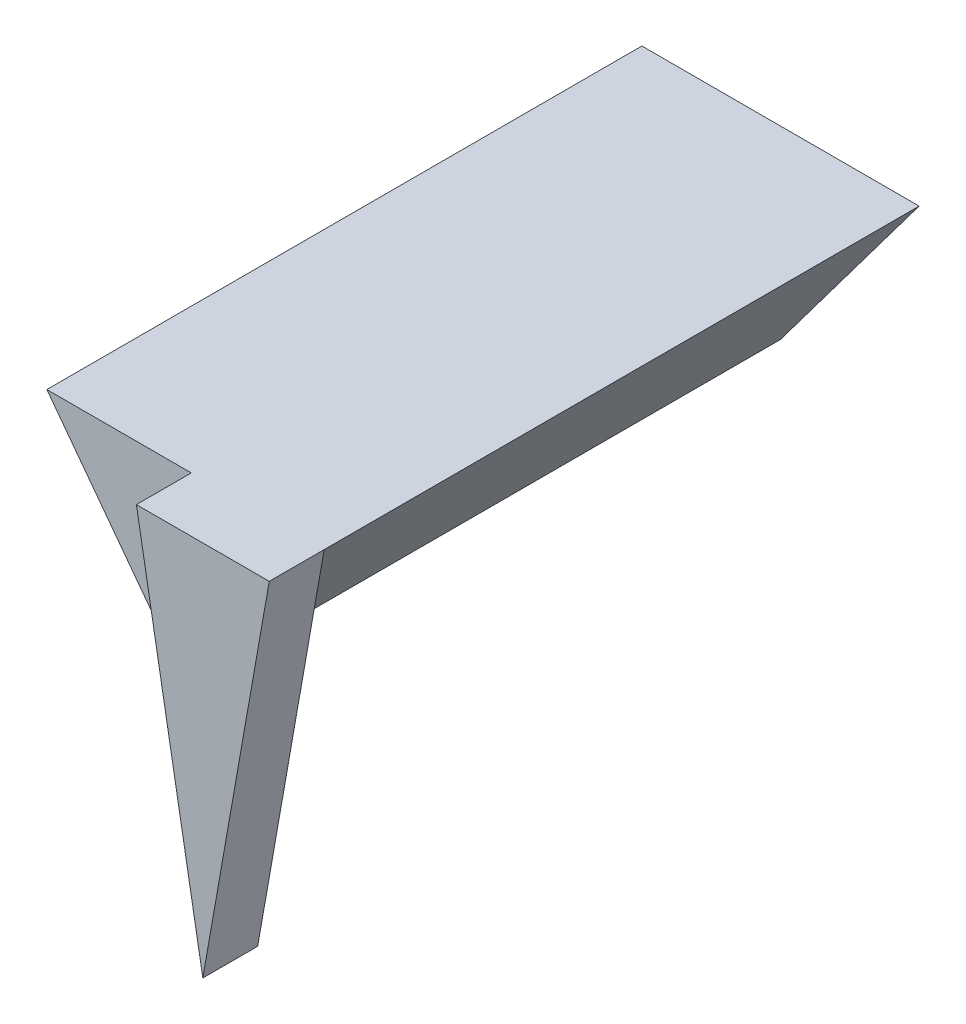
ISO-10303-21;
HEADER;
FILE_DESCRIPTION(('STEP AP214'),'2;1');
FILE_NAME('part.step','',(''),(''),'','','');
FILE_SCHEMA(('AUTOMOTIVE_DESIGN { 1 0 10303 214 1 1 1 1 }'));
ENDSEC;
DATA;
#1=APPLICATION_CONTEXT('core data for automotive mechanical design processes');
#2=APPLICATION_PROTOCOL_DEFINITION('international standard','automotive_design',2000,#1);
#3=PRODUCT_CONTEXT('',#1,'mechanical');
#4=PRODUCT('Part','Part','',(#3));
#5=PRODUCT_RELATED_PRODUCT_CATEGORY('part','',(#4));
#6=PRODUCT_DEFINITION_FORMATION('','',#4);
#7=PRODUCT_DEFINITION_CONTEXT('part definition',#1,'design');
#8=PRODUCT_DEFINITION('design','',#6,#7);
#9=PRODUCT_DEFINITION_SHAPE('','',#8);
#10=(LENGTH_UNIT() NAMED_UNIT(*) SI_UNIT(.MILLI.,.METRE.));
#11=(NAMED_UNIT(*) PLANE_ANGLE_UNIT() SI_UNIT($,.RADIAN.));
#12=(NAMED_UNIT(*) SI_UNIT($,.STERADIAN.) SOLID_ANGLE_UNIT());
#13=UNCERTAINTY_MEASURE_WITH_UNIT(LENGTH_MEASURE(1.E-05),#10,'distance_accuracy_value','');
#14=(GEOMETRIC_REPRESENTATION_CONTEXT(3) GLOBAL_UNCERTAINTY_ASSIGNED_CONTEXT((#13)) GLOBAL_UNIT_ASSIGNED_CONTEXT((#10,
#11,#12)) REPRESENTATION_CONTEXT('',''));
#15=CARTESIAN_POINT('',(0.,0.,0.));
#16=DIRECTION('',(0.,0.,1.));
#17=DIRECTION('',(1.,0.,0.));
#18=AXIS2_PLACEMENT_3D('',#15,#16,#17);
#19=CARTESIAN_POINT('',(0.,0.,-9.5));
#20=DIRECTION('',(0.,0.,1.));
#21=DIRECTION('',(1.,0.,0.));
#22=AXIS2_PLACEMENT_3D('',#19,#20,#21);
#23=PLANE('',#22);
#24=DIRECTION('',(-0.6,-0.8,0.));
#25=VECTOR('',#24,1.);
#26=CARTESIAN_POINT('',(-12.4999999999999,33.2197409256048,-9.5));
#27=LINE('',#26,#25);
#28=CARTESIAN_POINT('',(11.5000000000001,65.2197409256048,-9.5));
#29=VERTEX_POINT('',#28);
#30=CARTESIAN_POINT('',(-7.12193411100585,40.3904954442636,-9.5));
#31=VERTEX_POINT('',#30);
#32=EDGE_CURVE('E88',#29,#31,#27,.T.);
#33=ORIENTED_EDGE('',*,*,#32,.F.);
#34=DIRECTION('',(0.173648177666928,0.984807753012208,0.));
#35=VECTOR('',#34,1.);
#36=CARTESIAN_POINT('',(11.5000000000001,65.2197409256048,-9.5));
#37=LINE('',#36,#35);
#38=CARTESIAN_POINT('',(0.,0.,-9.5));
#39=VERTEX_POINT('',#38);
#40=EDGE_CURVE('E145',#39,#29,#37,.T.);
#41=ORIENTED_EDGE('',*,*,#40,.F.);
#42=DIRECTION('',(0.173648177666926,-0.984807753012209,0.));
#43=VECTOR('',#42,1.);
#44=CARTESIAN_POINT('',(0.,0.,-9.5));
#45=LINE('',#44,#43);
#46=EDGE_CURVE('E65',#31,#39,#45,.T.);
#47=ORIENTED_EDGE('',*,*,#46,.F.);
#48=EDGE_LOOP('',(#33,#41,#47));
#49=FACE_BOUND('',#48,.T.);
#50=ADVANCED_FACE('F44',(#49),#23,.F.);
#51=CARTESIAN_POINT('',(11.5000000000001,65.2197409256048,-9.5));
#52=DIRECTION('',(0.984807753012209,-0.173648177666928,0.));
#53=DIRECTION('',(0.173648177666928,0.984807753012209,0.));
#54=AXIS2_PLACEMENT_3D('',#51,#52,#53);
#55=PLANE('',#54);
#56=DIRECTION('',(0.173648177666928,0.984807753012208,0.));
#57=VECTOR('',#56,1.);
#58=CARTESIAN_POINT('',(11.5000000000001,65.2197409256048,0.));
#59=LINE('',#58,#57);
#60=CARTESIAN_POINT('',(0.,0.,0.));
#61=VERTEX_POINT('',#60);
#62=CARTESIAN_POINT('',(11.5000000000001,65.2197409256048,0.));
#63=VERTEX_POINT('',#62);
#64=EDGE_CURVE('E132',#61,#63,#59,.T.);
#65=ORIENTED_EDGE('',*,*,#64,.F.);
#66=DIRECTION('',(0.,0.,1.));
#67=VECTOR('',#66,1.);
#68=CARTESIAN_POINT('',(0.,0.,-9.5));
#69=LINE('',#68,#67);
#70=EDGE_CURVE('E11',#39,#61,#69,.T.);
#71=ORIENTED_EDGE('',*,*,#70,.F.);
#72=ORIENTED_EDGE('',*,*,#40,.T.);
#73=DIRECTION('',(0.,0.,1.));
#74=VECTOR('',#73,1.);
#75=CARTESIAN_POINT('',(11.5000000000001,65.2197409256048,-9.5));
#76=LINE('',#75,#74);
#77=EDGE_CURVE('E47',#29,#63,#76,.T.);
#78=ORIENTED_EDGE('',*,*,#77,.T.);
#79=EDGE_LOOP('',(#65,#71,#72,#78));
#80=FACE_BOUND('',#79,.T.);
#81=ADVANCED_FACE('F50',(#80),#55,.T.);
#82=CARTESIAN_POINT('',(0.,0.,-9.5));
#83=DIRECTION('',(-0.984807753012209,-0.173648177666926,0.));
#84=DIRECTION('',(0.173648177666926,-0.984807753012209,0.));
#85=AXIS2_PLACEMENT_3D('',#82,#83,#84);
#86=PLANE('',#85);
#87=DIRECTION('',(0.173648177666926,-0.984807753012209,0.));
#88=VECTOR('',#87,1.);
#89=CARTESIAN_POINT('',(0.,0.,0.));
#90=LINE('',#89,#88);
#91=CARTESIAN_POINT('',(-11.4999999999999,65.2197409256048,0.));
#92=VERTEX_POINT('',#91);
#93=EDGE_CURVE('E146',#92,#61,#90,.T.);
#94=ORIENTED_EDGE('',*,*,#93,.F.);
#95=DIRECTION('',(0.,0.,1.));
#96=VECTOR('',#95,1.);
#97=CARTESIAN_POINT('',(-11.4999999999999,65.2197409256048,-9.5));
#98=LINE('',#97,#96);
#99=CARTESIAN_POINT('',(-11.4999999999999,65.2197409256048,-9.5));
#100=VERTEX_POINT('',#99);
#101=EDGE_CURVE('E57',#100,#92,#98,.T.);
#102=ORIENTED_EDGE('',*,*,#101,.F.);
#103=EDGE_CURVE('E149',#100,#31,#45,.T.);
#104=ORIENTED_EDGE('',*,*,#103,.T.);
#105=ORIENTED_EDGE('',*,*,#46,.T.);
#106=ORIENTED_EDGE('',*,*,#70,.T.);
#107=EDGE_LOOP('',(#94,#102,#104,#105,#106));
#108=FACE_BOUND('',#107,.T.);
#109=ADVANCED_FACE('F165',(#108),#86,.T.);
#110=CARTESIAN_POINT('',(-11.4999999999999,65.2197409256048,-9.5));
#111=DIRECTION('',(0.,1.,0.));
#112=DIRECTION('',(0.,0.,1.));
#113=AXIS2_PLACEMENT_3D('',#110,#111,#112);
#114=PLANE('',#113);
#115=DIRECTION('',(-1.,0.,0.));
#116=VECTOR('',#115,1.);
#117=CARTESIAN_POINT('',(-11.4999999999999,65.2197409256048,0.));
#118=LINE('',#117,#116);
#119=EDGE_CURVE('E137',#63,#92,#118,.T.);
#120=ORIENTED_EDGE('',*,*,#119,.F.);
#121=ORIENTED_EDGE('',*,*,#77,.F.);
#122=DIRECTION('',(0.,0.,1.));
#123=VECTOR('',#122,1.);
#124=CARTESIAN_POINT('',(11.5000000000001,65.2197409256048,-112.5));
#125=LINE('',#124,#123);
#126=CARTESIAN_POINT('',(11.5000000000001,65.2197409256048,-112.5));
#127=VERTEX_POINT('',#126);
#128=EDGE_CURVE('E136',#127,#29,#125,.T.);
#129=ORIENTED_EDGE('',*,*,#128,.F.);
#130=DIRECTION('',(1.,0.,0.));
#131=VECTOR('',#130,1.);
#132=CARTESIAN_POINT('',(11.5000000000001,65.2197409256048,-112.5));
#133=LINE('',#132,#131);
#134=CARTESIAN_POINT('',(-36.4999999999999,65.2197409256048,-112.5));
#135=VERTEX_POINT('',#134);
#136=EDGE_CURVE('E119',#135,#127,#133,.T.);
#137=ORIENTED_EDGE('',*,*,#136,.F.);
#138=DIRECTION('',(0.,0.,1.));
#139=VECTOR('',#138,1.);
#140=CARTESIAN_POINT('',(-36.4999999999999,65.2197409256048,-112.5));
#141=LINE('',#140,#139);
#142=CARTESIAN_POINT('',(-36.4999999999999,65.2197409256048,-9.5));
#143=VERTEX_POINT('',#142);
#144=EDGE_CURVE('E114',#135,#143,#141,.T.);
#145=ORIENTED_EDGE('',*,*,#144,.T.);
#146=DIRECTION('',(1.,0.,0.));
#147=VECTOR('',#146,1.);
#148=CARTESIAN_POINT('',(11.5000000000001,65.2197409256048,-9.5));
#149=LINE('',#148,#147);
#150=EDGE_CURVE('E127',#143,#100,#149,.T.);
#151=ORIENTED_EDGE('',*,*,#150,.T.);
#152=ORIENTED_EDGE('',*,*,#101,.T.);
#153=EDGE_LOOP('',(#120,#121,#129,#137,#145,#151,#152));
#154=FACE_BOUND('',#153,.T.);
#155=ADVANCED_FACE('F157',(#154),#114,.T.);
#156=CARTESIAN_POINT('',(0.,0.,0.));
#157=DIRECTION('',(0.,0.,1.));
#158=DIRECTION('',(1.,0.,0.));
#159=AXIS2_PLACEMENT_3D('',#156,#157,#158);
#160=PLANE('',#159);
#161=ORIENTED_EDGE('',*,*,#64,.T.);
#162=ORIENTED_EDGE('',*,*,#119,.T.);
#163=ORIENTED_EDGE('',*,*,#93,.T.);
#164=EDGE_LOOP('',(#161,#162,#163));
#165=FACE_BOUND('',#164,.T.);
#166=ADVANCED_FACE('F161',(#165),#160,.T.);
#167=CARTESIAN_POINT('',(-12.4999999999999,33.2197409256048,-112.5));
#168=DIRECTION('',(-0.8,0.6,0.));
#169=DIRECTION('',(-0.6,-0.8,0.));
#170=AXIS2_PLACEMENT_3D('',#167,#168,#169);
#171=PLANE('',#170);
#172=ORIENTED_EDGE('',*,*,#32,.T.);
#173=CARTESIAN_POINT('',(-12.4999999999999,33.2197409256048,-9.5));
#174=VERTEX_POINT('',#173);
#175=EDGE_CURVE('E128',#31,#174,#27,.T.);
#176=ORIENTED_EDGE('',*,*,#175,.T.);
#177=DIRECTION('',(0.,0.,1.));
#178=VECTOR('',#177,1.);
#179=CARTESIAN_POINT('',(-12.4999999999999,33.2197409256048,-112.5));
#180=LINE('',#179,#178);
#181=CARTESIAN_POINT('',(-12.4999999999999,33.2197409256048,-112.5));
#182=VERTEX_POINT('',#181);
#183=EDGE_CURVE('E112',#182,#174,#180,.T.);
#184=ORIENTED_EDGE('',*,*,#183,.F.);
#185=DIRECTION('',(-0.6,-0.8,0.));
#186=VECTOR('',#185,1.);
#187=CARTESIAN_POINT('',(-12.4999999999999,33.2197409256048,-112.5));
#188=LINE('',#187,#186);
#189=EDGE_CURVE('E117',#127,#182,#188,.T.);
#190=ORIENTED_EDGE('',*,*,#189,.F.);
#191=ORIENTED_EDGE('',*,*,#128,.T.);
#192=EDGE_LOOP('',(#172,#176,#184,#190,#191));
#193=FACE_BOUND('',#192,.T.);
#194=ADVANCED_FACE('F126',(#193),#171,.F.);
#195=CARTESIAN_POINT('',(-36.4999999999999,65.2197409256048,-112.5));
#196=DIRECTION('',(0.8,0.6,0.));
#197=DIRECTION('',(-0.6,0.8,0.));
#198=AXIS2_PLACEMENT_3D('',#195,#196,#197);
#199=PLANE('',#198);
#200=DIRECTION('',(-0.6,0.8,0.));
#201=VECTOR('',#200,1.);
#202=CARTESIAN_POINT('',(-36.4999999999999,65.2197409256048,-9.5));
#203=LINE('',#202,#201);
#204=EDGE_CURVE('E169',#174,#143,#203,.T.);
#205=ORIENTED_EDGE('',*,*,#204,.T.);
#206=ORIENTED_EDGE('',*,*,#144,.F.);
#207=DIRECTION('',(-0.6,0.8,0.));
#208=VECTOR('',#207,1.);
#209=CARTESIAN_POINT('',(-36.4999999999999,65.2197409256048,-112.5));
#210=LINE('',#209,#208);
#211=EDGE_CURVE('E110',#182,#135,#210,.T.);
#212=ORIENTED_EDGE('',*,*,#211,.F.);
#213=ORIENTED_EDGE('',*,*,#183,.T.);
#214=EDGE_LOOP('',(#205,#206,#212,#213));
#215=FACE_BOUND('',#214,.T.);
#216=ADVANCED_FACE('F108',(#215),#199,.F.);
#217=CARTESIAN_POINT('',(0.,0.,-112.5));
#218=DIRECTION('',(0.,0.,-1.));
#219=DIRECTION('',(-1.,0.,0.));
#220=AXIS2_PLACEMENT_3D('',#217,#218,#219);
#221=PLANE('',#220);
#222=ORIENTED_EDGE('',*,*,#189,.T.);
#223=ORIENTED_EDGE('',*,*,#211,.T.);
#224=ORIENTED_EDGE('',*,*,#136,.T.);
#225=EDGE_LOOP('',(#222,#223,#224));
#226=FACE_BOUND('',#225,.T.);
#227=ADVANCED_FACE('F123',(#226),#221,.T.);
#228=CARTESIAN_POINT('',(0.,0.,-9.5));
#229=DIRECTION('',(0.,0.,-1.));
#230=DIRECTION('',(-1.,0.,0.));
#231=AXIS2_PLACEMENT_3D('',#228,#229,#230);
#232=PLANE('',#231);
#233=ORIENTED_EDGE('',*,*,#103,.F.);
#234=ORIENTED_EDGE('',*,*,#150,.F.);
#235=ORIENTED_EDGE('',*,*,#204,.F.);
#236=ORIENTED_EDGE('',*,*,#175,.F.);
#237=EDGE_LOOP('',(#233,#234,#235,#236));
#238=FACE_BOUND('',#237,.T.);
#239=ADVANCED_FACE('F167',(#238),#232,.F.);
#240=CLOSED_SHELL('',(#50,#81,#109,#155,#166,#194,#216,#227,#239));
#241=MANIFOLD_SOLID_BREP('B2',#240);
#242=ADVANCED_BREP_SHAPE_REPRESENTATION('',(#18,#241),#14);
#243=SHAPE_DEFINITION_REPRESENTATION(#9,#242);
ENDSEC;
END-ISO-10303-21;
